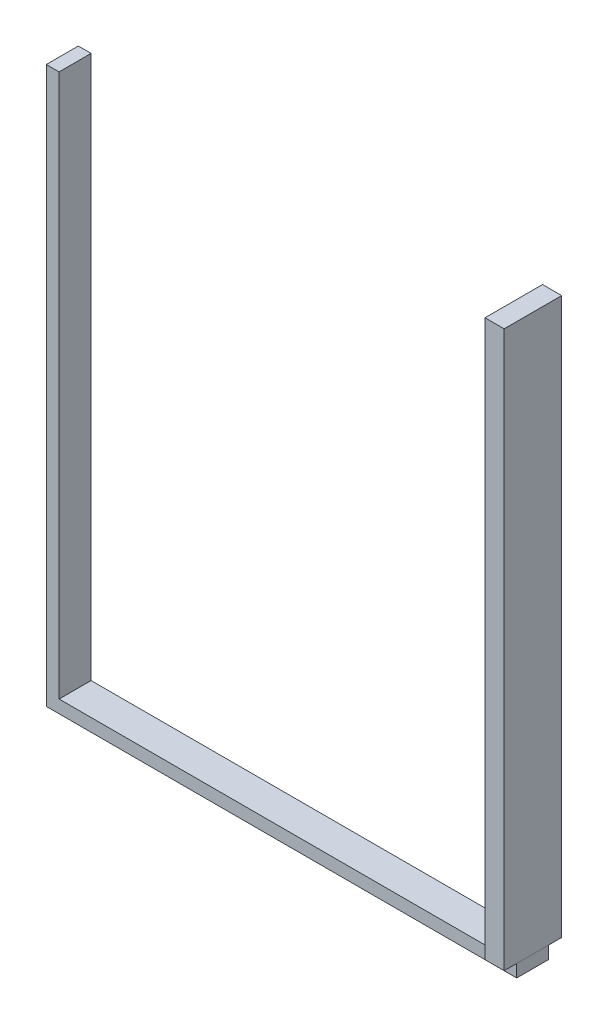
ISO-10303-21;
HEADER;
FILE_DESCRIPTION(('STEP AP214'),'2;1');
FILE_NAME('part.step','',(''),(''),'','','');
FILE_SCHEMA(('AUTOMOTIVE_DESIGN { 1 0 10303 214 1 1 1 1 }'));
ENDSEC;
DATA;
#1=APPLICATION_CONTEXT('core data for automotive mechanical design processes');
#2=APPLICATION_PROTOCOL_DEFINITION('international standard','automotive_design',2000,#1);
#3=PRODUCT_CONTEXT('',#1,'mechanical');
#4=PRODUCT('Part','Part','',(#3));
#5=PRODUCT_RELATED_PRODUCT_CATEGORY('part','',(#4));
#6=PRODUCT_DEFINITION_FORMATION('','',#4);
#7=PRODUCT_DEFINITION_CONTEXT('part definition',#1,'design');
#8=PRODUCT_DEFINITION('design','',#6,#7);
#9=PRODUCT_DEFINITION_SHAPE('','',#8);
#10=(LENGTH_UNIT() NAMED_UNIT(*) SI_UNIT(.MILLI.,.METRE.));
#11=(NAMED_UNIT(*) PLANE_ANGLE_UNIT() SI_UNIT($,.RADIAN.));
#12=(NAMED_UNIT(*) SI_UNIT($,.STERADIAN.) SOLID_ANGLE_UNIT());
#13=UNCERTAINTY_MEASURE_WITH_UNIT(LENGTH_MEASURE(1.E-05),#10,'distance_accuracy_value','');
#14=(GEOMETRIC_REPRESENTATION_CONTEXT(3) GLOBAL_UNCERTAINTY_ASSIGNED_CONTEXT((#13)) GLOBAL_UNIT_ASSIGNED_CONTEXT((#10,
#11,#12)) REPRESENTATION_CONTEXT('',''));
#15=CARTESIAN_POINT('',(0.,0.,0.));
#16=DIRECTION('',(0.,0.,1.));
#17=DIRECTION('',(1.,0.,0.));
#18=AXIS2_PLACEMENT_3D('',#15,#16,#17);
#19=CARTESIAN_POINT('',(147.0005,4.,0.));
#20=DIRECTION('',(0.,-1.,0.));
#21=DIRECTION('',(0.,0.,-1.));
#22=AXIS2_PLACEMENT_3D('',#19,#20,#21);
#23=PLANE('',#22);
#24=DIRECTION('',(0.,0.,1.));
#25=VECTOR('',#24,1.);
#26=CARTESIAN_POINT('',(141.097230738936,4.,3.99116666337177));
#27=LINE('',#26,#25);
#28=CARTESIAN_POINT('',(141.097230738936,4.,-9.99998));
#29=VERTEX_POINT('',#28);
#30=CARTESIAN_POINT('',(141.097230738936,4.,0.));
#31=VERTEX_POINT('',#30);
#32=EDGE_CURVE('E201',#29,#31,#27,.T.);
#33=ORIENTED_EDGE('',*,*,#32,.F.);
#34=DIRECTION('',(-1.,0.,0.));
#35=VECTOR('',#34,1.);
#36=CARTESIAN_POINT('',(147.0005,4.,-9.99998));
#37=LINE('',#36,#35);
#38=CARTESIAN_POINT('',(4.0005,4.00000000000006,-9.99998));
#39=VERTEX_POINT('',#38);
#40=EDGE_CURVE('E50',#29,#39,#37,.T.);
#41=ORIENTED_EDGE('',*,*,#40,.T.);
#42=DIRECTION('',(0.,0.,1.));
#43=VECTOR('',#42,1.);
#44=CARTESIAN_POINT('',(4.0005,4.,0.));
#45=LINE('',#44,#43);
#46=CARTESIAN_POINT('',(4.0005,4.,0.));
#47=VERTEX_POINT('',#46);
#48=EDGE_CURVE('E153',#39,#47,#45,.T.);
#49=ORIENTED_EDGE('',*,*,#48,.T.);
#50=DIRECTION('',(-1.,0.,0.));
#51=VECTOR('',#50,1.);
#52=CARTESIAN_POINT('',(147.0005,4.,0.));
#53=LINE('',#52,#51);
#54=EDGE_CURVE('E171',#31,#47,#53,.T.);
#55=ORIENTED_EDGE('',*,*,#54,.F.);
#56=EDGE_LOOP('',(#33,#41,#49,#55));
#57=FACE_BOUND('',#56,.T.);
#58=ADVANCED_FACE('F35',(#57),#23,.F.);
#59=CARTESIAN_POINT('',(4.0005,173.736,0.));
#60=DIRECTION('',(-1.,0.,0.));
#61=DIRECTION('',(0.,0.,1.));
#62=AXIS2_PLACEMENT_3D('',#59,#60,#61);
#63=PLANE('',#62);
#64=ORIENTED_EDGE('',*,*,#48,.F.);
#65=DIRECTION('',(0.,-1.,0.));
#66=VECTOR('',#65,1.);
#67=CARTESIAN_POINT('',(4.0005,173.736,-9.99998));
#68=LINE('',#67,#66);
#69=CARTESIAN_POINT('',(4.0005,173.736,-9.99998));
#70=VERTEX_POINT('',#69);
#71=EDGE_CURVE('E192',#70,#39,#68,.T.);
#72=ORIENTED_EDGE('',*,*,#71,.F.);
#73=DIRECTION('',(0.,0.,-1.));
#74=VECTOR('',#73,1.);
#75=CARTESIAN_POINT('',(4.0005,173.736,0.));
#76=LINE('',#75,#74);
#77=CARTESIAN_POINT('',(4.0005,173.736,0.));
#78=VERTEX_POINT('',#77);
#79=EDGE_CURVE('E182',#78,#70,#76,.T.);
#80=ORIENTED_EDGE('',*,*,#79,.F.);
#81=DIRECTION('',(0.,-1.,0.));
#82=VECTOR('',#81,1.);
#83=CARTESIAN_POINT('',(4.0005,173.736,0.));
#84=LINE('',#83,#82);
#85=EDGE_CURVE('E43',#78,#47,#84,.T.);
#86=ORIENTED_EDGE('',*,*,#85,.T.);
#87=EDGE_LOOP('',(#64,#72,#80,#86));
#88=FACE_BOUND('',#87,.T.);
#89=ADVANCED_FACE('F197',(#88),#63,.F.);
#90=CARTESIAN_POINT('',(0.,173.736,0.));
#91=DIRECTION('',(1.,0.,0.));
#92=DIRECTION('',(0.,0.,-1.));
#93=AXIS2_PLACEMENT_3D('',#90,#91,#92);
#94=PLANE('',#93);
#95=DIRECTION('',(0.,0.,1.));
#96=VECTOR('',#95,1.);
#97=CARTESIAN_POINT('',(0.,0.,0.));
#98=LINE('',#97,#96);
#99=CARTESIAN_POINT('',(0.,0.,-9.99998));
#100=VERTEX_POINT('',#99);
#101=CARTESIAN_POINT('',(0.,0.,0.));
#102=VERTEX_POINT('',#101);
#103=EDGE_CURVE('E178',#100,#102,#98,.T.);
#104=ORIENTED_EDGE('',*,*,#103,.T.);
#105=DIRECTION('',(0.,-1.,0.));
#106=VECTOR('',#105,1.);
#107=CARTESIAN_POINT('',(0.,173.736,0.));
#108=LINE('',#107,#106);
#109=CARTESIAN_POINT('',(0.,173.736,0.));
#110=VERTEX_POINT('',#109);
#111=EDGE_CURVE('E11',#110,#102,#108,.T.);
#112=ORIENTED_EDGE('',*,*,#111,.F.);
#113=DIRECTION('',(0.,0.,1.));
#114=VECTOR('',#113,1.);
#115=CARTESIAN_POINT('',(0.,173.736,0.));
#116=LINE('',#115,#114);
#117=CARTESIAN_POINT('',(0.,173.736,-9.99998));
#118=VERTEX_POINT('',#117);
#119=EDGE_CURVE('E179',#118,#110,#116,.T.);
#120=ORIENTED_EDGE('',*,*,#119,.F.);
#121=DIRECTION('',(0.,-1.,0.));
#122=VECTOR('',#121,1.);
#123=CARTESIAN_POINT('',(0.,173.736,-9.99998));
#124=LINE('',#123,#122);
#125=EDGE_CURVE('E185',#118,#100,#124,.T.);
#126=ORIENTED_EDGE('',*,*,#125,.T.);
#127=EDGE_LOOP('',(#104,#112,#120,#126));
#128=FACE_BOUND('',#127,.T.);
#129=ADVANCED_FACE('F37',(#128),#94,.F.);
#130=CARTESIAN_POINT('',(0.,173.736,0.));
#131=DIRECTION('',(0.,0.,-1.));
#132=DIRECTION('',(-1.,0.,0.));
#133=AXIS2_PLACEMENT_3D('',#130,#131,#132);
#134=PLANE('',#133);
#135=DIRECTION('',(1.,0.,0.));
#136=VECTOR('',#135,1.);
#137=CARTESIAN_POINT('',(0.,0.,0.));
#138=LINE('',#137,#136);
#139=CARTESIAN_POINT('',(147.0005,0.,0.));
#140=VERTEX_POINT('',#139);
#141=EDGE_CURVE('E188',#102,#140,#138,.T.);
#142=ORIENTED_EDGE('',*,*,#141,.T.);
#143=DIRECTION('',(0.,-1.,0.));
#144=VECTOR('',#143,1.);
#145=CARTESIAN_POINT('',(147.0005,0.,0.));
#146=LINE('',#145,#144);
#147=CARTESIAN_POINT('',(147.0005,4.,0.));
#148=VERTEX_POINT('',#147);
#149=EDGE_CURVE('E155',#148,#140,#146,.T.);
#150=ORIENTED_EDGE('',*,*,#149,.F.);
#151=EDGE_CURVE('E173',#148,#31,#53,.T.);
#152=ORIENTED_EDGE('',*,*,#151,.T.);
#153=ORIENTED_EDGE('',*,*,#54,.T.);
#154=ORIENTED_EDGE('',*,*,#85,.F.);
#155=DIRECTION('',(1.,0.,0.));
#156=VECTOR('',#155,1.);
#157=CARTESIAN_POINT('',(0.,173.736,0.));
#158=LINE('',#157,#156);
#159=EDGE_CURVE('E81',#110,#78,#158,.T.);
#160=ORIENTED_EDGE('',*,*,#159,.F.);
#161=ORIENTED_EDGE('',*,*,#111,.T.);
#162=EDGE_LOOP('',(#142,#150,#152,#153,#154,#160,#161));
#163=FACE_BOUND('',#162,.T.);
#164=ADVANCED_FACE('F203',(#163),#134,.F.);
#165=CARTESIAN_POINT('',(0.,173.736,-9.99998));
#166=DIRECTION('',(0.,0.,1.));
#167=DIRECTION('',(1.,0.,0.));
#168=AXIS2_PLACEMENT_3D('',#165,#166,#167);
#169=PLANE('',#168);
#170=DIRECTION('',(-1.,0.,0.));
#171=VECTOR('',#170,1.);
#172=CARTESIAN_POINT('',(0.,0.,-9.99998));
#173=LINE('',#172,#171);
#174=CARTESIAN_POINT('',(147.0005,0.,-9.99998));
#175=VERTEX_POINT('',#174);
#176=EDGE_CURVE('E74',#175,#100,#173,.T.);
#177=ORIENTED_EDGE('',*,*,#176,.T.);
#178=ORIENTED_EDGE('',*,*,#125,.F.);
#179=DIRECTION('',(-1.,0.,0.));
#180=VECTOR('',#179,1.);
#181=CARTESIAN_POINT('',(0.,173.736,-9.99998));
#182=LINE('',#181,#180);
#183=EDGE_CURVE('E59',#70,#118,#182,.T.);
#184=ORIENTED_EDGE('',*,*,#183,.F.);
#185=ORIENTED_EDGE('',*,*,#71,.T.);
#186=ORIENTED_EDGE('',*,*,#40,.F.);
#187=CARTESIAN_POINT('',(147.0005,4.,-9.99998));
#188=VERTEX_POINT('',#187);
#189=EDGE_CURVE('E176',#188,#29,#37,.T.);
#190=ORIENTED_EDGE('',*,*,#189,.F.);
#191=DIRECTION('',(0.,1.,0.));
#192=VECTOR('',#191,1.);
#193=CARTESIAN_POINT('',(147.0005,0.,-9.99998));
#194=LINE('',#193,#192);
#195=EDGE_CURVE('E166',#175,#188,#194,.T.);
#196=ORIENTED_EDGE('',*,*,#195,.F.);
#197=EDGE_LOOP('',(#177,#178,#184,#185,#186,#190,#196));
#198=FACE_BOUND('',#197,.T.);
#199=ADVANCED_FACE('F212',(#198),#169,.F.);
#200=CARTESIAN_POINT('',(0.,173.736,0.));
#201=DIRECTION('',(0.,-1.,0.));
#202=DIRECTION('',(0.,0.,-1.));
#203=AXIS2_PLACEMENT_3D('',#200,#201,#202);
#204=PLANE('',#203);
#205=ORIENTED_EDGE('',*,*,#119,.T.);
#206=ORIENTED_EDGE('',*,*,#159,.T.);
#207=ORIENTED_EDGE('',*,*,#79,.T.);
#208=ORIENTED_EDGE('',*,*,#183,.T.);
#209=EDGE_LOOP('',(#205,#206,#207,#208));
#210=FACE_BOUND('',#209,.T.);
#211=ADVANCED_FACE('F249',(#210),#204,.F.);
#212=CARTESIAN_POINT('',(0.,0.,0.));
#213=DIRECTION('',(0.,-1.,0.));
#214=DIRECTION('',(0.,0.,-1.));
#215=AXIS2_PLACEMENT_3D('',#212,#213,#214);
#216=PLANE('',#215);
#217=ORIENTED_EDGE('',*,*,#103,.F.);
#218=ORIENTED_EDGE('',*,*,#176,.F.);
#219=DIRECTION('',(0.,0.,-1.));
#220=VECTOR('',#219,1.);
#221=CARTESIAN_POINT('',(147.0005,0.,0.));
#222=LINE('',#221,#220);
#223=EDGE_CURVE('E163',#140,#175,#222,.T.);
#224=ORIENTED_EDGE('',*,*,#223,.F.);
#225=ORIENTED_EDGE('',*,*,#141,.F.);
#226=EDGE_LOOP('',(#217,#218,#224,#225));
#227=FACE_BOUND('',#226,.T.);
#228=ADVANCED_FACE('F252',(#227),#216,.T.);
#229=CARTESIAN_POINT('',(147.0005,0.,0.));
#230=DIRECTION('',(-1.,0.,0.));
#231=DIRECTION('',(0.,0.,1.));
#232=AXIS2_PLACEMENT_3D('',#229,#230,#231);
#233=PLANE('',#232);
#234=ORIENTED_EDGE('',*,*,#149,.T.);
#235=ORIENTED_EDGE('',*,*,#223,.T.);
#236=ORIENTED_EDGE('',*,*,#195,.T.);
#237=DIRECTION('',(0.,0.,1.));
#238=VECTOR('',#237,1.);
#239=CARTESIAN_POINT('',(147.0005,4.,0.));
#240=LINE('',#239,#238);
#241=EDGE_CURVE('E169',#188,#148,#240,.T.);
#242=ORIENTED_EDGE('',*,*,#241,.T.);
#243=EDGE_LOOP('',(#234,#235,#236,#242));
#244=FACE_BOUND('',#243,.T.);
#245=ADVANCED_FACE('F209',(#244),#233,.F.);
#246=CARTESIAN_POINT('',(0.,4.,0.));
#247=DIRECTION('',(0.,1.,0.));
#248=DIRECTION('',(0.,0.,1.));
#249=AXIS2_PLACEMENT_3D('',#246,#247,#248);
#250=PLANE('',#249);
#251=CARTESIAN_POINT('',(141.097230738936,4.,3.99116666337177));
#252=VERTEX_POINT('',#251);
#253=EDGE_CURVE('E207',#31,#252,#27,.T.);
#254=ORIENTED_EDGE('',*,*,#253,.F.);
#255=ORIENTED_EDGE('',*,*,#151,.F.);
#256=ORIENTED_EDGE('',*,*,#241,.F.);
#257=ORIENTED_EDGE('',*,*,#189,.T.);
#258=CARTESIAN_POINT('',(141.097230738936,4.00000000000001,-13.987453322833));
#259=VERTEX_POINT('',#258);
#260=EDGE_CURVE('E215',#259,#29,#27,.T.);
#261=ORIENTED_EDGE('',*,*,#260,.F.);
#262=DIRECTION('',(-1.,0.,0.));
#263=VECTOR('',#262,1.);
#264=CARTESIAN_POINT('',(147.077070440936,4.00000000000001,-13.987453322833));
#265=LINE('',#264,#263);
#266=CARTESIAN_POINT('',(147.077070440936,4.00000000000001,-13.987453322833));
#267=VERTEX_POINT('',#266);
#268=EDGE_CURVE('E221',#267,#259,#265,.T.);
#269=ORIENTED_EDGE('',*,*,#268,.F.);
#270=DIRECTION('',(0.,0.,-1.));
#271=VECTOR('',#270,1.);
#272=CARTESIAN_POINT('',(147.077070440936,4.,3.99116666337177));
#273=LINE('',#272,#271);
#274=CARTESIAN_POINT('',(147.077070440936,4.,3.99116666337177));
#275=VERTEX_POINT('',#274);
#276=EDGE_CURVE('E152',#275,#267,#273,.T.);
#277=ORIENTED_EDGE('',*,*,#276,.F.);
#278=DIRECTION('',(1.,0.,0.));
#279=VECTOR('',#278,1.);
#280=CARTESIAN_POINT('',(147.077070440936,4.,3.99116666337177));
#281=LINE('',#280,#279);
#282=EDGE_CURVE('E148',#252,#275,#281,.T.);
#283=ORIENTED_EDGE('',*,*,#282,.F.);
#284=EDGE_LOOP('',(#254,#255,#256,#257,#261,#269,#277,#283));
#285=FACE_BOUND('',#284,.T.);
#286=ADVANCED_FACE('F205',(#285),#250,.F.);
#287=CARTESIAN_POINT('',(147.077070440936,177.736,3.99116666337183));
#288=DIRECTION('',(-1.,0.,0.));
#289=DIRECTION('',(0.,0.,1.));
#290=AXIS2_PLACEMENT_3D('',#287,#288,#289);
#291=PLANE('',#290);
#292=ORIENTED_EDGE('',*,*,#276,.T.);
#293=DIRECTION('',(0.,-1.,0.));
#294=VECTOR('',#293,1.);
#295=CARTESIAN_POINT('',(147.077070440936,177.736,-13.987453322833));
#296=LINE('',#295,#294);
#297=CARTESIAN_POINT('',(147.077070440936,177.736,-13.987453322833));
#298=VERTEX_POINT('',#297);
#299=EDGE_CURVE('E132',#298,#267,#296,.T.);
#300=ORIENTED_EDGE('',*,*,#299,.F.);
#301=DIRECTION('',(0.,0.,-1.));
#302=VECTOR('',#301,1.);
#303=CARTESIAN_POINT('',(147.077070440936,177.736,3.99116666337183));
#304=LINE('',#303,#302);
#305=CARTESIAN_POINT('',(147.077070440936,177.736,3.99116666337183));
#306=VERTEX_POINT('',#305);
#307=EDGE_CURVE('E139',#306,#298,#304,.T.);
#308=ORIENTED_EDGE('',*,*,#307,.F.);
#309=DIRECTION('',(0.,-1.,0.));
#310=VECTOR('',#309,1.);
#311=CARTESIAN_POINT('',(147.077070440936,177.736,3.99116666337183));
#312=LINE('',#311,#310);
#313=EDGE_CURVE('E227',#306,#275,#312,.T.);
#314=ORIENTED_EDGE('',*,*,#313,.T.);
#315=EDGE_LOOP('',(#292,#300,#308,#314));
#316=FACE_BOUND('',#315,.T.);
#317=ADVANCED_FACE('F150',(#316),#291,.F.);
#318=CARTESIAN_POINT('',(147.077070440936,177.736,-13.987453322833));
#319=DIRECTION('',(0.,0.,1.));
#320=DIRECTION('',(0.,-1.,0.));
#321=AXIS2_PLACEMENT_3D('',#318,#319,#320);
#322=PLANE('',#321);
#323=ORIENTED_EDGE('',*,*,#268,.T.);
#324=DIRECTION('',(0.,-1.,0.));
#325=VECTOR('',#324,1.);
#326=CARTESIAN_POINT('',(141.097230738936,177.736,-13.987453322833));
#327=LINE('',#326,#325);
#328=CARTESIAN_POINT('',(141.097230738936,177.736,-13.987453322833));
#329=VERTEX_POINT('',#328);
#330=EDGE_CURVE('E135',#329,#259,#327,.T.);
#331=ORIENTED_EDGE('',*,*,#330,.F.);
#332=DIRECTION('',(-1.,0.,0.));
#333=VECTOR('',#332,1.);
#334=CARTESIAN_POINT('',(147.077070440936,177.736,-13.987453322833));
#335=LINE('',#334,#333);
#336=EDGE_CURVE('E128',#298,#329,#335,.T.);
#337=ORIENTED_EDGE('',*,*,#336,.F.);
#338=ORIENTED_EDGE('',*,*,#299,.T.);
#339=EDGE_LOOP('',(#323,#331,#337,#338));
#340=FACE_BOUND('',#339,.T.);
#341=ADVANCED_FACE('F130',(#340),#322,.F.);
#342=CARTESIAN_POINT('',(141.097230738936,177.736,3.99116666337183));
#343=DIRECTION('',(1.,0.,0.));
#344=DIRECTION('',(0.,0.,-1.));
#345=AXIS2_PLACEMENT_3D('',#342,#343,#344);
#346=PLANE('',#345);
#347=ORIENTED_EDGE('',*,*,#260,.T.);
#348=ORIENTED_EDGE('',*,*,#32,.T.);
#349=ORIENTED_EDGE('',*,*,#253,.T.);
#350=DIRECTION('',(0.,-1.,0.));
#351=VECTOR('',#350,1.);
#352=CARTESIAN_POINT('',(141.097230738936,177.736,3.99116666337183));
#353=LINE('',#352,#351);
#354=CARTESIAN_POINT('',(141.097230738936,177.736,3.99116666337183));
#355=VERTEX_POINT('',#354);
#356=EDGE_CURVE('E157',#355,#252,#353,.T.);
#357=ORIENTED_EDGE('',*,*,#356,.F.);
#358=DIRECTION('',(0.,0.,1.));
#359=VECTOR('',#358,1.);
#360=CARTESIAN_POINT('',(141.097230738936,177.736,3.99116666337183));
#361=LINE('',#360,#359);
#362=EDGE_CURVE('E138',#329,#355,#361,.T.);
#363=ORIENTED_EDGE('',*,*,#362,.F.);
#364=ORIENTED_EDGE('',*,*,#330,.T.);
#365=EDGE_LOOP('',(#347,#348,#349,#357,#363,#364));
#366=FACE_BOUND('',#365,.T.);
#367=ADVANCED_FACE('F217',(#366),#346,.F.);
#368=CARTESIAN_POINT('',(147.077070440936,177.736,3.99116666337183));
#369=DIRECTION('',(0.,0.,-1.));
#370=DIRECTION('',(0.,1.,0.));
#371=AXIS2_PLACEMENT_3D('',#368,#369,#370);
#372=PLANE('',#371);
#373=ORIENTED_EDGE('',*,*,#282,.T.);
#374=ORIENTED_EDGE('',*,*,#313,.F.);
#375=DIRECTION('',(1.,0.,0.));
#376=VECTOR('',#375,1.);
#377=CARTESIAN_POINT('',(147.077070440936,177.736,3.99116666337183));
#378=LINE('',#377,#376);
#379=EDGE_CURVE('E144',#355,#306,#378,.T.);
#380=ORIENTED_EDGE('',*,*,#379,.F.);
#381=ORIENTED_EDGE('',*,*,#356,.T.);
#382=EDGE_LOOP('',(#373,#374,#380,#381));
#383=FACE_BOUND('',#382,.T.);
#384=ADVANCED_FACE('F229',(#383),#372,.F.);
#385=CARTESIAN_POINT('',(0.,177.736,0.));
#386=DIRECTION('',(0.,1.,0.));
#387=DIRECTION('',(0.,0.,1.));
#388=AXIS2_PLACEMENT_3D('',#385,#386,#387);
#389=PLANE('',#388);
#390=ORIENTED_EDGE('',*,*,#307,.T.);
#391=ORIENTED_EDGE('',*,*,#336,.T.);
#392=ORIENTED_EDGE('',*,*,#362,.T.);
#393=ORIENTED_EDGE('',*,*,#379,.T.);
#394=EDGE_LOOP('',(#390,#391,#392,#393));
#395=FACE_BOUND('',#394,.T.);
#396=ADVANCED_FACE('F142',(#395),#389,.T.);
#397=CLOSED_SHELL('',(#58,#89,#129,#164,#199,#211,#228,#245,#286,#317,#341,#367,#384,#396));
#398=MANIFOLD_SOLID_BREP('B2',#397);
#399=ADVANCED_BREP_SHAPE_REPRESENTATION('',(#18,#398),#14);
#400=SHAPE_DEFINITION_REPRESENTATION(#9,#399);
ENDSEC;
END-ISO-10303-21;
